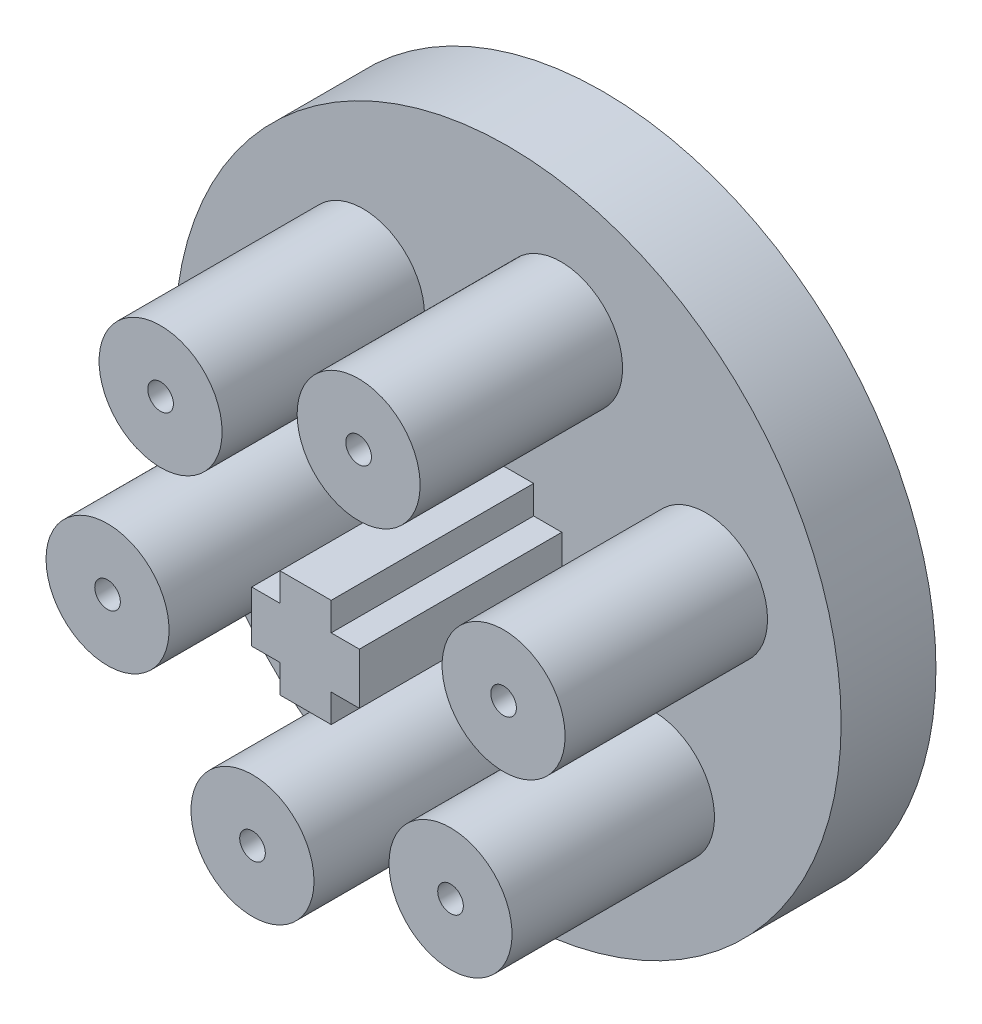
ISO-10303-21;
HEADER;
FILE_DESCRIPTION(('STEP AP214'),'2;1');
FILE_NAME('part.step','',(''),(''),'','','');
FILE_SCHEMA(('AUTOMOTIVE_DESIGN { 1 0 10303 214 1 1 1 1 }'));
ENDSEC;
DATA;
#1=APPLICATION_CONTEXT('core data for automotive mechanical design processes');
#2=APPLICATION_PROTOCOL_DEFINITION('international standard','automotive_design',2000,#1);
#3=PRODUCT_CONTEXT('',#1,'mechanical');
#4=PRODUCT('Part','Part','',(#3));
#5=PRODUCT_RELATED_PRODUCT_CATEGORY('part','',(#4));
#6=PRODUCT_DEFINITION_FORMATION('','',#4);
#7=PRODUCT_DEFINITION_CONTEXT('part definition',#1,'design');
#8=PRODUCT_DEFINITION('design','',#6,#7);
#9=PRODUCT_DEFINITION_SHAPE('','',#8);
#10=(LENGTH_UNIT() NAMED_UNIT(*) SI_UNIT(.MILLI.,.METRE.));
#11=(NAMED_UNIT(*) PLANE_ANGLE_UNIT() SI_UNIT($,.RADIAN.));
#12=(NAMED_UNIT(*) SI_UNIT($,.STERADIAN.) SOLID_ANGLE_UNIT());
#13=UNCERTAINTY_MEASURE_WITH_UNIT(LENGTH_MEASURE(1.E-05),#10,'distance_accuracy_value','');
#14=(GEOMETRIC_REPRESENTATION_CONTEXT(3) GLOBAL_UNCERTAINTY_ASSIGNED_CONTEXT((#13)) GLOBAL_UNIT_ASSIGNED_CONTEXT((#10,
#11,#12)) REPRESENTATION_CONTEXT('',''));
#15=CARTESIAN_POINT('',(0.,0.,0.));
#16=DIRECTION('',(0.,0.,1.));
#17=DIRECTION('',(1.,0.,0.));
#18=AXIS2_PLACEMENT_3D('',#15,#16,#17);
#19=CARTESIAN_POINT('',(0.,0.,3.7));
#20=DIRECTION('',(0.,0.,1.));
#21=DIRECTION('',(1.,0.,0.));
#22=AXIS2_PLACEMENT_3D('',#19,#20,#21);
#23=PLANE('',#22);
#24=CARTESIAN_POINT('',(-7.72740661031258,-2.07055236082003,3.7));
#25=DIRECTION('',(0.,0.,1.));
#26=DIRECTION('',(0.50000000000001,0.866025403784433,0.));
#27=AXIS2_PLACEMENT_3D('',#24,#25,#26);
#28=CIRCLE('',#27,2.4);
#29=CARTESIAN_POINT('',(-6.52740661031256,0.00790860826260396,3.7));
#30=VERTEX_POINT('',#29);
#31=EDGE_CURVE('E767',#30,#30,#28,.T.);
#32=ORIENTED_EDGE('',*,*,#31,.F.);
#33=EDGE_LOOP('',(#32));
#34=FACE_BOUND('',#33,.T.);
#35=CARTESIAN_POINT('',(-2.07055236082028,-7.72740661031252,3.7));
#36=DIRECTION('',(0.,0.,1.));
#37=DIRECTION('',(-0.499999999999992,0.866025403784443,0.));
#38=AXIS2_PLACEMENT_3D('',#35,#36,#37);
#39=CIRCLE('',#38,2.4);
#40=CARTESIAN_POINT('',(-3.27055236082026,-5.64894564122985,3.7));
#41=VERTEX_POINT('',#40);
#42=EDGE_CURVE('E758',#41,#41,#39,.T.);
#43=ORIENTED_EDGE('',*,*,#42,.F.);
#44=EDGE_LOOP('',(#43));
#45=FACE_BOUND('',#44,.T.);
#46=CARTESIAN_POINT('',(5.65685424949235,-5.65685424949241,3.7));
#47=DIRECTION('',(0.,0.,1.));
#48=DIRECTION('',(-1.,0.,0.));
#49=AXIS2_PLACEMENT_3D('',#46,#47,#48);
#50=CIRCLE('',#49,2.4);
#51=CARTESIAN_POINT('',(3.25685424949235,-5.65685424949241,3.7));
#52=VERTEX_POINT('',#51);
#53=EDGE_CURVE('E749',#52,#52,#50,.T.);
#54=ORIENTED_EDGE('',*,*,#53,.F.);
#55=EDGE_LOOP('',(#54));
#56=FACE_BOUND('',#55,.T.);
#57=CARTESIAN_POINT('',(7.72740661031257,2.07055236082009,3.7));
#58=DIRECTION('',(0.,0.,1.));
#59=DIRECTION('',(-0.500000000000004,-0.866025403784436,0.));
#60=AXIS2_PLACEMENT_3D('',#57,#58,#59);
#61=CIRCLE('',#60,2.4);
#62=CARTESIAN_POINT('',(6.52740661031256,-0.00790860826255799,3.7));
#63=VERTEX_POINT('',#62);
#64=EDGE_CURVE('E741',#63,#63,#61,.T.);
#65=ORIENTED_EDGE('',*,*,#64,.F.);
#66=EDGE_LOOP('',(#65));
#67=FACE_BOUND('',#66,.T.);
#68=CARTESIAN_POINT('',(2.07055236082022,7.72740661031253,3.7));
#69=DIRECTION('',(0.,0.,1.));
#70=DIRECTION('',(0.499999999999998,-0.86602540378444,0.));
#71=AXIS2_PLACEMENT_3D('',#68,#69,#70);
#72=CIRCLE('',#71,2.4);
#73=CARTESIAN_POINT('',(3.27055236082022,5.64894564122988,3.7));
#74=VERTEX_POINT('',#73);
#75=EDGE_CURVE('E732',#74,#74,#72,.T.);
#76=ORIENTED_EDGE('',*,*,#75,.F.);
#77=EDGE_LOOP('',(#76));
#78=FACE_BOUND('',#77,.T.);
#79=CARTESIAN_POINT('',(-5.65685424949235,5.65685424949241,3.7));
#80=DIRECTION('',(0.,0.,1.));
#81=DIRECTION('',(1.,0.,0.));
#82=AXIS2_PLACEMENT_3D('',#79,#80,#81);
#83=CIRCLE('',#82,2.4);
#84=CARTESIAN_POINT('',(-3.25685424949235,5.65685424949241,3.7));
#85=VERTEX_POINT('',#84);
#86=EDGE_CURVE('E156',#85,#85,#83,.T.);
#87=ORIENTED_EDGE('',*,*,#86,.F.);
#88=EDGE_LOOP('',(#87));
#89=FACE_BOUND('',#88,.T.);
#90=CARTESIAN_POINT('',(0.,0.,3.7));
#91=DIRECTION('',(0.,0.,1.));
#92=DIRECTION('',(1.,0.,0.));
#93=AXIS2_PLACEMENT_3D('',#90,#91,#92);
#94=CIRCLE('',#93,13.);
#95=CARTESIAN_POINT('',(13.,0.,3.7));
#96=VERTEX_POINT('',#95);
#97=EDGE_CURVE('E180',#96,#96,#94,.T.);
#98=ORIENTED_EDGE('',*,*,#97,.T.);
#99=EDGE_LOOP('',(#98));
#100=FACE_BOUND('',#99,.T.);
#101=DIRECTION('',(0.,1.,0.));
#102=VECTOR('',#101,1.);
#103=CARTESIAN_POINT('',(-2.1,-1.,3.7));
#104=LINE('',#103,#102);
#105=CARTESIAN_POINT('',(-2.1,-1.,3.7));
#106=VERTEX_POINT('',#105);
#107=CARTESIAN_POINT('',(-2.1,1.,3.7));
#108=VERTEX_POINT('',#107);
#109=EDGE_CURVE('E170',#106,#108,#104,.T.);
#110=ORIENTED_EDGE('',*,*,#109,.T.);
#111=DIRECTION('',(1.,0.,0.));
#112=VECTOR('',#111,1.);
#113=CARTESIAN_POINT('',(-2.1,1.,3.7));
#114=LINE('',#113,#112);
#115=CARTESIAN_POINT('',(-1.,1.,3.7));
#116=VERTEX_POINT('',#115);
#117=EDGE_CURVE('E78',#108,#116,#114,.T.);
#118=ORIENTED_EDGE('',*,*,#117,.T.);
#119=DIRECTION('',(0.,1.,0.));
#120=VECTOR('',#119,1.);
#121=CARTESIAN_POINT('',(-1.,-2.1,3.7));
#122=LINE('',#121,#120);
#123=CARTESIAN_POINT('',(-1.,2.1,3.7));
#124=VERTEX_POINT('',#123);
#125=EDGE_CURVE('E145',#116,#124,#122,.T.);
#126=ORIENTED_EDGE('',*,*,#125,.T.);
#127=DIRECTION('',(1.,0.,0.));
#128=VECTOR('',#127,1.);
#129=CARTESIAN_POINT('',(-1.,2.1,3.7));
#130=LINE('',#129,#128);
#131=CARTESIAN_POINT('',(1.,2.1,3.7));
#132=VERTEX_POINT('',#131);
#133=EDGE_CURVE('E161',#124,#132,#130,.T.);
#134=ORIENTED_EDGE('',*,*,#133,.T.);
#135=DIRECTION('',(0.,1.,0.));
#136=VECTOR('',#135,1.);
#137=CARTESIAN_POINT('',(1.,-2.1,3.7));
#138=LINE('',#137,#136);
#139=CARTESIAN_POINT('',(1.,1.,3.7));
#140=VERTEX_POINT('',#139);
#141=EDGE_CURVE('E151',#140,#132,#138,.T.);
#142=ORIENTED_EDGE('',*,*,#141,.F.);
#143=CARTESIAN_POINT('',(2.1,1.,3.7));
#144=VERTEX_POINT('',#143);
#145=EDGE_CURVE('E674',#140,#144,#114,.T.);
#146=ORIENTED_EDGE('',*,*,#145,.T.);
#147=DIRECTION('',(0.,1.,0.));
#148=VECTOR('',#147,1.);
#149=CARTESIAN_POINT('',(2.1,-1.,3.7));
#150=LINE('',#149,#148);
#151=CARTESIAN_POINT('',(2.1,-1.,3.7));
#152=VERTEX_POINT('',#151);
#153=EDGE_CURVE('E711',#152,#144,#150,.T.);
#154=ORIENTED_EDGE('',*,*,#153,.F.);
#155=DIRECTION('',(1.,0.,0.));
#156=VECTOR('',#155,1.);
#157=CARTESIAN_POINT('',(-2.1,-1.,3.7));
#158=LINE('',#157,#156);
#159=CARTESIAN_POINT('',(1.,-1.,3.7));
#160=VERTEX_POINT('',#159);
#161=EDGE_CURVE('E710',#160,#152,#158,.T.);
#162=ORIENTED_EDGE('',*,*,#161,.F.);
#163=CARTESIAN_POINT('',(1.,-2.1,3.7));
#164=VERTEX_POINT('',#163);
#165=EDGE_CURVE('E150',#164,#160,#138,.T.);
#166=ORIENTED_EDGE('',*,*,#165,.F.);
#167=DIRECTION('',(1.,0.,0.));
#168=VECTOR('',#167,1.);
#169=CARTESIAN_POINT('',(-1.,-2.1,3.7));
#170=LINE('',#169,#168);
#171=CARTESIAN_POINT('',(-1.,-2.1,3.7));
#172=VERTEX_POINT('',#171);
#173=EDGE_CURVE('E125',#172,#164,#170,.T.);
#174=ORIENTED_EDGE('',*,*,#173,.F.);
#175=CARTESIAN_POINT('',(-1.,-1.,3.7));
#176=VERTEX_POINT('',#175);
#177=EDGE_CURVE('E137',#172,#176,#122,.T.);
#178=ORIENTED_EDGE('',*,*,#177,.T.);
#179=EDGE_CURVE('E707',#106,#176,#158,.T.);
#180=ORIENTED_EDGE('',*,*,#179,.F.);
#181=EDGE_LOOP('',(#110,#118,#126,#134,#142,#146,#154,#162,#166,#174,#178,#180));
#182=FACE_BOUND('',#181,.T.);
#183=ADVANCED_FACE('F63',(#34,#45,#56,#67,#78,#89,#100,#182),#23,.T.);
#184=CARTESIAN_POINT('',(0.,0.,3.7));
#185=DIRECTION('',(0.,0.,-1.));
#186=DIRECTION('',(-1.,0.,0.));
#187=AXIS2_PLACEMENT_3D('',#184,#185,#186);
#188=CYLINDRICAL_SURFACE('',#187,13.);
#189=ORIENTED_EDGE('',*,*,#97,.F.);
#190=EDGE_LOOP('',(#189));
#191=FACE_BOUND('',#190,.T.);
#192=CARTESIAN_POINT('',(0.,0.,0.));
#193=DIRECTION('',(0.,0.,1.));
#194=DIRECTION('',(1.,0.,0.));
#195=AXIS2_PLACEMENT_3D('',#192,#193,#194);
#196=CIRCLE('',#195,13.);
#197=CARTESIAN_POINT('',(13.,0.,0.));
#198=VERTEX_POINT('',#197);
#199=EDGE_CURVE('E179',#198,#198,#196,.T.);
#200=ORIENTED_EDGE('',*,*,#199,.T.);
#201=EDGE_LOOP('',(#200));
#202=FACE_BOUND('',#201,.T.);
#203=ADVANCED_FACE('F65',(#191,#202),#188,.T.);
#204=CARTESIAN_POINT('',(0.,0.,0.));
#205=DIRECTION('',(0.,0.,1.));
#206=DIRECTION('',(1.,0.,0.));
#207=AXIS2_PLACEMENT_3D('',#204,#205,#206);
#208=PLANE('',#207);
#209=ORIENTED_EDGE('',*,*,#199,.F.);
#210=EDGE_LOOP('',(#209));
#211=FACE_BOUND('',#210,.T.);
#212=ADVANCED_FACE('F232',(#211),#208,.F.);
#213=CARTESIAN_POINT('',(-2.1,1.,11.6));
#214=DIRECTION('',(0.,1.,0.));
#215=DIRECTION('',(0.,0.,1.));
#216=AXIS2_PLACEMENT_3D('',#213,#214,#215);
#217=PLANE('',#216);
#218=DIRECTION('',(0.,0.,1.));
#219=VECTOR('',#218,1.);
#220=CARTESIAN_POINT('',(-1.,1.,11.6));
#221=LINE('',#220,#219);
#222=CARTESIAN_POINT('',(-1.,1.,11.6));
#223=VERTEX_POINT('',#222);
#224=EDGE_CURVE('E171',#116,#223,#221,.T.);
#225=ORIENTED_EDGE('',*,*,#224,.F.);
#226=ORIENTED_EDGE('',*,*,#117,.F.);
#227=DIRECTION('',(0.,0.,-1.));
#228=VECTOR('',#227,1.);
#229=CARTESIAN_POINT('',(-2.1,1.,11.6));
#230=LINE('',#229,#228);
#231=CARTESIAN_POINT('',(-2.1,1.,11.6));
#232=VERTEX_POINT('',#231);
#233=EDGE_CURVE('E698',#232,#108,#230,.T.);
#234=ORIENTED_EDGE('',*,*,#233,.F.);
#235=DIRECTION('',(1.,0.,0.));
#236=VECTOR('',#235,1.);
#237=CARTESIAN_POINT('',(-2.1,1.,11.6));
#238=LINE('',#237,#236);
#239=EDGE_CURVE('E720',#232,#223,#238,.T.);
#240=ORIENTED_EDGE('',*,*,#239,.T.);
#241=EDGE_LOOP('',(#225,#226,#234,#240));
#242=FACE_BOUND('',#241,.T.);
#243=ADVANCED_FACE('F314',(#242),#217,.T.);
#244=CARTESIAN_POINT('',(-2.1,-1.,11.6));
#245=DIRECTION('',(-1.,0.,0.));
#246=DIRECTION('',(0.,0.,1.));
#247=AXIS2_PLACEMENT_3D('',#244,#245,#246);
#248=PLANE('',#247);
#249=ORIENTED_EDGE('',*,*,#109,.F.);
#250=DIRECTION('',(0.,0.,-1.));
#251=VECTOR('',#250,1.);
#252=CARTESIAN_POINT('',(-2.1,-1.,11.6));
#253=LINE('',#252,#251);
#254=CARTESIAN_POINT('',(-2.1,-1.,11.6));
#255=VERTEX_POINT('',#254);
#256=EDGE_CURVE('E173',#255,#106,#253,.T.);
#257=ORIENTED_EDGE('',*,*,#256,.F.);
#258=DIRECTION('',(0.,1.,0.));
#259=VECTOR('',#258,1.);
#260=CARTESIAN_POINT('',(-2.1,-1.,11.6));
#261=LINE('',#260,#259);
#262=EDGE_CURVE('E709',#255,#232,#261,.T.);
#263=ORIENTED_EDGE('',*,*,#262,.T.);
#264=ORIENTED_EDGE('',*,*,#233,.T.);
#265=EDGE_LOOP('',(#249,#257,#263,#264));
#266=FACE_BOUND('',#265,.T.);
#267=ADVANCED_FACE('F307',(#266),#248,.T.);
#268=CARTESIAN_POINT('',(-2.1,-1.,11.6));
#269=DIRECTION('',(0.,1.,0.));
#270=DIRECTION('',(0.,0.,1.));
#271=AXIS2_PLACEMENT_3D('',#268,#269,#270);
#272=PLANE('',#271);
#273=ORIENTED_EDGE('',*,*,#179,.T.);
#274=DIRECTION('',(0.,0.,1.));
#275=VECTOR('',#274,1.);
#276=CARTESIAN_POINT('',(-1.,-1.,11.6));
#277=LINE('',#276,#275);
#278=CARTESIAN_POINT('',(-1.,-1.,11.6));
#279=VERTEX_POINT('',#278);
#280=EDGE_CURVE('E141',#176,#279,#277,.T.);
#281=ORIENTED_EDGE('',*,*,#280,.T.);
#282=DIRECTION('',(1.,0.,0.));
#283=VECTOR('',#282,1.);
#284=CARTESIAN_POINT('',(-2.1,-1.,11.6));
#285=LINE('',#284,#283);
#286=EDGE_CURVE('E700',#255,#279,#285,.T.);
#287=ORIENTED_EDGE('',*,*,#286,.F.);
#288=ORIENTED_EDGE('',*,*,#256,.T.);
#289=EDGE_LOOP('',(#273,#281,#287,#288));
#290=FACE_BOUND('',#289,.T.);
#291=ADVANCED_FACE('F303',(#290),#272,.F.);
#292=CARTESIAN_POINT('',(0.,0.,11.6));
#293=DIRECTION('',(0.,0.,-1.));
#294=DIRECTION('',(-1.,0.,0.));
#295=AXIS2_PLACEMENT_3D('',#292,#293,#294);
#296=PLANE('',#295);
#297=ORIENTED_EDGE('',*,*,#286,.T.);
#298=DIRECTION('',(0.,1.,0.));
#299=VECTOR('',#298,1.);
#300=CARTESIAN_POINT('',(-1.,-2.1,11.6));
#301=LINE('',#300,#299);
#302=CARTESIAN_POINT('',(-1.,-2.1,11.6));
#303=VERTEX_POINT('',#302);
#304=EDGE_CURVE('E133',#303,#279,#301,.T.);
#305=ORIENTED_EDGE('',*,*,#304,.F.);
#306=DIRECTION('',(1.,0.,0.));
#307=VECTOR('',#306,1.);
#308=CARTESIAN_POINT('',(-1.,-2.1,11.6));
#309=LINE('',#308,#307);
#310=CARTESIAN_POINT('',(1.,-2.1,11.6));
#311=VERTEX_POINT('',#310);
#312=EDGE_CURVE('E128',#303,#311,#309,.T.);
#313=ORIENTED_EDGE('',*,*,#312,.T.);
#314=DIRECTION('',(0.,1.,0.));
#315=VECTOR('',#314,1.);
#316=CARTESIAN_POINT('',(1.,-2.1,11.6));
#317=LINE('',#316,#315);
#318=CARTESIAN_POINT('',(1.,-1.,11.6));
#319=VERTEX_POINT('',#318);
#320=EDGE_CURVE('E692',#311,#319,#317,.T.);
#321=ORIENTED_EDGE('',*,*,#320,.T.);
#322=CARTESIAN_POINT('',(2.1,-1.,11.6));
#323=VERTEX_POINT('',#322);
#324=EDGE_CURVE('E716',#319,#323,#285,.T.);
#325=ORIENTED_EDGE('',*,*,#324,.T.);
#326=DIRECTION('',(0.,1.,0.));
#327=VECTOR('',#326,1.);
#328=CARTESIAN_POINT('',(2.1,-1.,11.6));
#329=LINE('',#328,#327);
#330=CARTESIAN_POINT('',(2.1,1.,11.6));
#331=VERTEX_POINT('',#330);
#332=EDGE_CURVE('E717',#323,#331,#329,.T.);
#333=ORIENTED_EDGE('',*,*,#332,.T.);
#334=CARTESIAN_POINT('',(1.,1.,11.6));
#335=VERTEX_POINT('',#334);
#336=EDGE_CURVE('E723',#335,#331,#238,.T.);
#337=ORIENTED_EDGE('',*,*,#336,.F.);
#338=CARTESIAN_POINT('',(1.,2.1,11.6));
#339=VERTEX_POINT('',#338);
#340=EDGE_CURVE('E694',#335,#339,#317,.T.);
#341=ORIENTED_EDGE('',*,*,#340,.T.);
#342=DIRECTION('',(1.,0.,0.));
#343=VECTOR('',#342,1.);
#344=CARTESIAN_POINT('',(-1.,2.1,11.6));
#345=LINE('',#344,#343);
#346=CARTESIAN_POINT('',(-1.,2.1,11.6));
#347=VERTEX_POINT('',#346);
#348=EDGE_CURVE('E689',#347,#339,#345,.T.);
#349=ORIENTED_EDGE('',*,*,#348,.F.);
#350=EDGE_CURVE('E691',#223,#347,#301,.T.);
#351=ORIENTED_EDGE('',*,*,#350,.F.);
#352=ORIENTED_EDGE('',*,*,#239,.F.);
#353=ORIENTED_EDGE('',*,*,#262,.F.);
#354=EDGE_LOOP('',(#297,#305,#313,#321,#325,#333,#337,#341,#349,#351,#352,#353));
#355=FACE_BOUND('',#354,.T.);
#356=ADVANCED_FACE('F299',(#355),#296,.F.);
#357=CARTESIAN_POINT('',(2.1,-1.,11.6));
#358=DIRECTION('',(-1.,0.,0.));
#359=DIRECTION('',(0.,0.,1.));
#360=AXIS2_PLACEMENT_3D('',#357,#358,#359);
#361=PLANE('',#360);
#362=ORIENTED_EDGE('',*,*,#153,.T.);
#363=DIRECTION('',(0.,0.,-1.));
#364=VECTOR('',#363,1.);
#365=CARTESIAN_POINT('',(2.1,1.,11.6));
#366=LINE('',#365,#364);
#367=EDGE_CURVE('E677',#331,#144,#366,.T.);
#368=ORIENTED_EDGE('',*,*,#367,.F.);
#369=ORIENTED_EDGE('',*,*,#332,.F.);
#370=DIRECTION('',(0.,0.,-1.));
#371=VECTOR('',#370,1.);
#372=CARTESIAN_POINT('',(2.1,-1.,11.6));
#373=LINE('',#372,#371);
#374=EDGE_CURVE('E702',#323,#152,#373,.T.);
#375=ORIENTED_EDGE('',*,*,#374,.T.);
#376=EDGE_LOOP('',(#362,#368,#369,#375));
#377=FACE_BOUND('',#376,.T.);
#378=ADVANCED_FACE('F302',(#377),#361,.F.);
#379=ORIENTED_EDGE('',*,*,#145,.F.);
#380=DIRECTION('',(0.,0.,1.));
#381=VECTOR('',#380,1.);
#382=CARTESIAN_POINT('',(1.,1.,11.6));
#383=LINE('',#382,#381);
#384=EDGE_CURVE('E87',#140,#335,#383,.T.);
#385=ORIENTED_EDGE('',*,*,#384,.T.);
#386=ORIENTED_EDGE('',*,*,#336,.T.);
#387=ORIENTED_EDGE('',*,*,#367,.T.);
#388=EDGE_LOOP('',(#379,#385,#386,#387));
#389=FACE_BOUND('',#388,.T.);
#390=ADVANCED_FACE('F312',(#389),#217,.T.);
#391=DIRECTION('',(0.,0.,1.));
#392=VECTOR('',#391,1.);
#393=CARTESIAN_POINT('',(1.,-1.,11.6));
#394=LINE('',#393,#392);
#395=EDGE_CURVE('E175',#160,#319,#394,.T.);
#396=ORIENTED_EDGE('',*,*,#395,.F.);
#397=ORIENTED_EDGE('',*,*,#161,.T.);
#398=ORIENTED_EDGE('',*,*,#374,.F.);
#399=ORIENTED_EDGE('',*,*,#324,.F.);
#400=EDGE_LOOP('',(#396,#397,#398,#399));
#401=FACE_BOUND('',#400,.T.);
#402=ADVANCED_FACE('F309',(#401),#272,.F.);
#403=CARTESIAN_POINT('',(1.,-2.1,11.6));
#404=DIRECTION('',(-1.,0.,0.));
#405=DIRECTION('',(0.,0.,1.));
#406=AXIS2_PLACEMENT_3D('',#403,#404,#405);
#407=PLANE('',#406);
#408=ORIENTED_EDGE('',*,*,#384,.F.);
#409=ORIENTED_EDGE('',*,*,#141,.T.);
#410=DIRECTION('',(0.,0.,-1.));
#411=VECTOR('',#410,1.);
#412=CARTESIAN_POINT('',(1.,2.1,11.6));
#413=LINE('',#412,#411);
#414=EDGE_CURVE('E165',#339,#132,#413,.T.);
#415=ORIENTED_EDGE('',*,*,#414,.F.);
#416=ORIENTED_EDGE('',*,*,#340,.F.);
#417=EDGE_LOOP('',(#408,#409,#415,#416));
#418=FACE_BOUND('',#417,.T.);
#419=ADVANCED_FACE('F328',(#418),#407,.F.);
#420=CARTESIAN_POINT('',(-1.,2.1,11.6));
#421=DIRECTION('',(0.,1.,0.));
#422=DIRECTION('',(0.,0.,1.));
#423=AXIS2_PLACEMENT_3D('',#420,#421,#422);
#424=PLANE('',#423);
#425=ORIENTED_EDGE('',*,*,#133,.F.);
#426=DIRECTION('',(0.,0.,-1.));
#427=VECTOR('',#426,1.);
#428=CARTESIAN_POINT('',(-1.,2.1,11.6));
#429=LINE('',#428,#427);
#430=EDGE_CURVE('E132',#347,#124,#429,.T.);
#431=ORIENTED_EDGE('',*,*,#430,.F.);
#432=ORIENTED_EDGE('',*,*,#348,.T.);
#433=ORIENTED_EDGE('',*,*,#414,.T.);
#434=EDGE_LOOP('',(#425,#431,#432,#433));
#435=FACE_BOUND('',#434,.T.);
#436=ADVANCED_FACE('F323',(#435),#424,.T.);
#437=CARTESIAN_POINT('',(-1.,-2.1,11.6));
#438=DIRECTION('',(-1.,0.,0.));
#439=DIRECTION('',(0.,0.,1.));
#440=AXIS2_PLACEMENT_3D('',#437,#438,#439);
#441=PLANE('',#440);
#442=ORIENTED_EDGE('',*,*,#125,.F.);
#443=ORIENTED_EDGE('',*,*,#224,.T.);
#444=ORIENTED_EDGE('',*,*,#350,.T.);
#445=ORIENTED_EDGE('',*,*,#430,.T.);
#446=EDGE_LOOP('',(#442,#443,#444,#445));
#447=FACE_BOUND('',#446,.T.);
#448=ADVANCED_FACE('F320',(#447),#441,.T.);
#449=CARTESIAN_POINT('',(-1.,-2.1,11.6));
#450=DIRECTION('',(0.,1.,0.));
#451=DIRECTION('',(0.,0.,1.));
#452=AXIS2_PLACEMENT_3D('',#449,#450,#451);
#453=PLANE('',#452);
#454=ORIENTED_EDGE('',*,*,#173,.T.);
#455=DIRECTION('',(0.,0.,-1.));
#456=VECTOR('',#455,1.);
#457=CARTESIAN_POINT('',(1.,-2.1,11.6));
#458=LINE('',#457,#456);
#459=EDGE_CURVE('E168',#311,#164,#458,.T.);
#460=ORIENTED_EDGE('',*,*,#459,.F.);
#461=ORIENTED_EDGE('',*,*,#312,.F.);
#462=DIRECTION('',(0.,0.,-1.));
#463=VECTOR('',#462,1.);
#464=CARTESIAN_POINT('',(-1.,-2.1,11.6));
#465=LINE('',#464,#463);
#466=EDGE_CURVE('E120',#303,#172,#465,.T.);
#467=ORIENTED_EDGE('',*,*,#466,.T.);
#468=EDGE_LOOP('',(#454,#460,#461,#467));
#469=FACE_BOUND('',#468,.T.);
#470=ADVANCED_FACE('F122',(#469),#453,.F.);
#471=ORIENTED_EDGE('',*,*,#165,.T.);
#472=ORIENTED_EDGE('',*,*,#395,.T.);
#473=ORIENTED_EDGE('',*,*,#320,.F.);
#474=ORIENTED_EDGE('',*,*,#459,.T.);
#475=EDGE_LOOP('',(#471,#472,#473,#474));
#476=FACE_BOUND('',#475,.T.);
#477=ADVANCED_FACE('F325',(#476),#407,.F.);
#478=ORIENTED_EDGE('',*,*,#280,.F.);
#479=ORIENTED_EDGE('',*,*,#177,.F.);
#480=ORIENTED_EDGE('',*,*,#466,.F.);
#481=ORIENTED_EDGE('',*,*,#304,.T.);
#482=EDGE_LOOP('',(#478,#479,#480,#481));
#483=FACE_BOUND('',#482,.T.);
#484=ADVANCED_FACE('F138',(#483),#441,.T.);
#485=CARTESIAN_POINT('',(-5.65685424949235,5.65685424949241,11.6));
#486=DIRECTION('',(0.,0.,1.));
#487=DIRECTION('',(1.,0.,0.));
#488=AXIS2_PLACEMENT_3D('',#485,#486,#487);
#489=PLANE('',#488);
#490=CARTESIAN_POINT('',(-5.65685424949235,5.65685424949241,11.6));
#491=DIRECTION('',(0.,0.,1.));
#492=DIRECTION('',(1.,0.,0.));
#493=AXIS2_PLACEMENT_3D('',#490,#491,#492);
#494=CIRCLE('',#493,2.4);
#495=CARTESIAN_POINT('',(-3.25685424949235,5.65685424949241,11.6));
#496=VERTEX_POINT('',#495);
#497=EDGE_CURVE('E152',#496,#496,#494,.T.);
#498=ORIENTED_EDGE('',*,*,#497,.T.);
#499=EDGE_LOOP('',(#498));
#500=FACE_BOUND('',#499,.T.);
#501=CARTESIAN_POINT('',(-5.65685424949235,5.65685424949241,11.6));
#502=DIRECTION('',(0.,0.,1.));
#503=DIRECTION('',(1.,0.,0.));
#504=AXIS2_PLACEMENT_3D('',#501,#502,#503);
#505=CIRCLE('',#504,0.500000000000001);
#506=CARTESIAN_POINT('',(-5.15685424949235,5.65685424949241,11.6));
#507=VERTEX_POINT('',#506);
#508=EDGE_CURVE('E727',#507,#507,#505,.T.);
#509=ORIENTED_EDGE('',*,*,#508,.F.);
#510=EDGE_LOOP('',(#509));
#511=FACE_BOUND('',#510,.T.);
#512=ADVANCED_FACE('F292',(#500,#511),#489,.T.);
#513=CARTESIAN_POINT('',(-5.65685424949235,5.65685424949241,11.6));
#514=DIRECTION('',(0.,0.,-1.));
#515=DIRECTION('',(-1.,0.,0.));
#516=AXIS2_PLACEMENT_3D('',#513,#514,#515);
#517=CYLINDRICAL_SURFACE('',#516,2.4);
#518=ORIENTED_EDGE('',*,*,#497,.F.);
#519=EDGE_LOOP('',(#518));
#520=FACE_BOUND('',#519,.T.);
#521=ORIENTED_EDGE('',*,*,#86,.T.);
#522=EDGE_LOOP('',(#521));
#523=FACE_BOUND('',#522,.T.);
#524=ADVANCED_FACE('F248',(#520,#523),#517,.T.);
#525=CARTESIAN_POINT('',(-5.65685424949235,5.65685424949241,11.6));
#526=DIRECTION('',(0.,0.,-1.));
#527=DIRECTION('',(-1.,0.,0.));
#528=AXIS2_PLACEMENT_3D('',#525,#526,#527);
#529=CYLINDRICAL_SURFACE('',#528,0.500000000000001);
#530=ORIENTED_EDGE('',*,*,#508,.T.);
#531=EDGE_LOOP('',(#530));
#532=FACE_BOUND('',#531,.T.);
#533=CARTESIAN_POINT('',(-5.65685424949235,5.65685424949241,3.7));
#534=DIRECTION('',(0.,0.,1.));
#535=DIRECTION('',(1.,0.,0.));
#536=AXIS2_PLACEMENT_3D('',#533,#534,#535);
#537=CIRCLE('',#536,0.500000000000001);
#538=CARTESIAN_POINT('',(-5.15685424949235,5.65685424949241,3.7));
#539=VERTEX_POINT('',#538);
#540=EDGE_CURVE('E183',#539,#539,#537,.F.);
#541=ORIENTED_EDGE('',*,*,#540,.T.);
#542=EDGE_LOOP('',(#541));
#543=FACE_BOUND('',#542,.T.);
#544=ADVANCED_FACE('F238',(#532,#543),#529,.F.);
#545=ORIENTED_EDGE('',*,*,#540,.F.);
#546=EDGE_LOOP('',(#545));
#547=FACE_BOUND('',#546,.T.);
#548=ADVANCED_FACE('F228',(#547),#23,.T.);
#549=CARTESIAN_POINT('',(2.07055236082022,7.72740661031253,11.6));
#550=DIRECTION('',(0.,0.,1.));
#551=DIRECTION('',(0.499999999999998,-0.86602540378444,0.));
#552=AXIS2_PLACEMENT_3D('',#549,#550,#551);
#553=PLANE('',#552);
#554=CARTESIAN_POINT('',(2.07055236082022,7.72740661031253,11.6));
#555=DIRECTION('',(0.,0.,1.));
#556=DIRECTION('',(0.499999999999998,-0.86602540378444,0.));
#557=AXIS2_PLACEMENT_3D('',#554,#555,#556);
#558=CIRCLE('',#557,2.4);
#559=CARTESIAN_POINT('',(3.27055236082022,5.64894564122988,11.6));
#560=VERTEX_POINT('',#559);
#561=EDGE_CURVE('E731',#560,#560,#558,.T.);
#562=ORIENTED_EDGE('',*,*,#561,.T.);
#563=EDGE_LOOP('',(#562));
#564=FACE_BOUND('',#563,.T.);
#565=CARTESIAN_POINT('',(2.07055236082022,7.72740661031253,11.6));
#566=DIRECTION('',(0.,0.,1.));
#567=DIRECTION('',(0.499999999999998,-0.86602540378444,0.));
#568=AXIS2_PLACEMENT_3D('',#565,#566,#567);
#569=CIRCLE('',#568,0.500000000000001);
#570=CARTESIAN_POINT('',(2.32055236082022,7.29439390842031,11.6));
#571=VERTEX_POINT('',#570);
#572=EDGE_CURVE('E735',#571,#571,#569,.T.);
#573=ORIENTED_EDGE('',*,*,#572,.F.);
#574=EDGE_LOOP('',(#573));
#575=FACE_BOUND('',#574,.T.);
#576=ADVANCED_FACE('F237',(#564,#575),#553,.T.);
#577=CARTESIAN_POINT('',(2.07055236082022,7.72740661031253,11.6));
#578=DIRECTION('',(0.,0.,-1.));
#579=DIRECTION('',(-1.,0.,0.));
#580=AXIS2_PLACEMENT_3D('',#577,#578,#579);
#581=CYLINDRICAL_SURFACE('',#580,2.4);
#582=ORIENTED_EDGE('',*,*,#561,.F.);
#583=EDGE_LOOP('',(#582));
#584=FACE_BOUND('',#583,.T.);
#585=ORIENTED_EDGE('',*,*,#75,.T.);
#586=EDGE_LOOP('',(#585));
#587=FACE_BOUND('',#586,.T.);
#588=ADVANCED_FACE('F245',(#584,#587),#581,.T.);
#589=CARTESIAN_POINT('',(2.07055236082022,7.72740661031253,11.6));
#590=DIRECTION('',(0.,0.,-1.));
#591=DIRECTION('',(-1.,0.,0.));
#592=AXIS2_PLACEMENT_3D('',#589,#590,#591);
#593=CYLINDRICAL_SURFACE('',#592,0.500000000000001);
#594=ORIENTED_EDGE('',*,*,#572,.T.);
#595=EDGE_LOOP('',(#594));
#596=FACE_BOUND('',#595,.T.);
#597=CARTESIAN_POINT('',(2.07055236082022,7.72740661031253,3.7));
#598=DIRECTION('',(0.,0.,1.));
#599=DIRECTION('',(1.,0.,0.));
#600=AXIS2_PLACEMENT_3D('',#597,#598,#599);
#601=CIRCLE('',#600,0.500000000000001);
#602=CARTESIAN_POINT('',(2.57055236082023,7.72740661031253,3.7));
#603=VERTEX_POINT('',#602);
#604=EDGE_CURVE('E188',#603,#603,#601,.F.);
#605=ORIENTED_EDGE('',*,*,#604,.T.);
#606=EDGE_LOOP('',(#605));
#607=FACE_BOUND('',#606,.T.);
#608=ADVANCED_FACE('F254',(#596,#607),#593,.F.);
#609=ORIENTED_EDGE('',*,*,#604,.F.);
#610=EDGE_LOOP('',(#609));
#611=FACE_BOUND('',#610,.T.);
#612=ADVANCED_FACE('F240',(#611),#23,.T.);
#613=CARTESIAN_POINT('',(7.72740661031257,2.07055236082009,11.6));
#614=DIRECTION('',(0.,0.,1.));
#615=DIRECTION('',(-0.500000000000004,-0.866025403784436,0.));
#616=AXIS2_PLACEMENT_3D('',#613,#614,#615);
#617=PLANE('',#616);
#618=CARTESIAN_POINT('',(7.72740661031257,2.07055236082009,11.6));
#619=DIRECTION('',(0.,0.,1.));
#620=DIRECTION('',(-0.500000000000004,-0.866025403784436,0.));
#621=AXIS2_PLACEMENT_3D('',#618,#619,#620);
#622=CIRCLE('',#621,2.4);
#623=CARTESIAN_POINT('',(6.52740661031256,-0.00790860826255799,11.6));
#624=VERTEX_POINT('',#623);
#625=EDGE_CURVE('E740',#624,#624,#622,.T.);
#626=ORIENTED_EDGE('',*,*,#625,.T.);
#627=EDGE_LOOP('',(#626));
#628=FACE_BOUND('',#627,.T.);
#629=CARTESIAN_POINT('',(7.72740661031257,2.07055236082009,11.6));
#630=DIRECTION('',(0.,0.,1.));
#631=DIRECTION('',(-0.500000000000004,-0.866025403784436,0.));
#632=AXIS2_PLACEMENT_3D('',#629,#630,#631);
#633=CIRCLE('',#632,0.500000000000001);
#634=CARTESIAN_POINT('',(7.47740661031257,1.63753965892787,11.6));
#635=VERTEX_POINT('',#634);
#636=EDGE_CURVE('E744',#635,#635,#633,.T.);
#637=ORIENTED_EDGE('',*,*,#636,.F.);
#638=EDGE_LOOP('',(#637));
#639=FACE_BOUND('',#638,.T.);
#640=ADVANCED_FACE('F253',(#628,#639),#617,.T.);
#641=CARTESIAN_POINT('',(7.72740661031257,2.07055236082009,11.6));
#642=DIRECTION('',(0.,0.,-1.));
#643=DIRECTION('',(-1.,0.,0.));
#644=AXIS2_PLACEMENT_3D('',#641,#642,#643);
#645=CYLINDRICAL_SURFACE('',#644,2.4);
#646=ORIENTED_EDGE('',*,*,#625,.F.);
#647=EDGE_LOOP('',(#646));
#648=FACE_BOUND('',#647,.T.);
#649=ORIENTED_EDGE('',*,*,#64,.T.);
#650=EDGE_LOOP('',(#649));
#651=FACE_BOUND('',#650,.T.);
#652=ADVANCED_FACE('F260',(#648,#651),#645,.T.);
#653=CARTESIAN_POINT('',(7.72740661031257,2.07055236082009,11.6));
#654=DIRECTION('',(0.,0.,-1.));
#655=DIRECTION('',(-1.,0.,0.));
#656=AXIS2_PLACEMENT_3D('',#653,#654,#655);
#657=CYLINDRICAL_SURFACE('',#656,0.500000000000001);
#658=ORIENTED_EDGE('',*,*,#636,.T.);
#659=EDGE_LOOP('',(#658));
#660=FACE_BOUND('',#659,.T.);
#661=CARTESIAN_POINT('',(7.72740661031257,2.07055236082009,3.7));
#662=DIRECTION('',(0.,0.,1.));
#663=DIRECTION('',(1.,0.,0.));
#664=AXIS2_PLACEMENT_3D('',#661,#662,#663);
#665=CIRCLE('',#664,0.500000000000001);
#666=CARTESIAN_POINT('',(8.22740661031257,2.07055236082009,3.7));
#667=VERTEX_POINT('',#666);
#668=EDGE_CURVE('E191',#667,#667,#665,.F.);
#669=ORIENTED_EDGE('',*,*,#668,.T.);
#670=EDGE_LOOP('',(#669));
#671=FACE_BOUND('',#670,.T.);
#672=ADVANCED_FACE('F268',(#660,#671),#657,.F.);
#673=ORIENTED_EDGE('',*,*,#668,.F.);
#674=EDGE_LOOP('',(#673));
#675=FACE_BOUND('',#674,.T.);
#676=ADVANCED_FACE('F222',(#675),#23,.T.);
#677=CARTESIAN_POINT('',(5.65685424949235,-5.65685424949241,11.6));
#678=DIRECTION('',(0.,0.,1.));
#679=DIRECTION('',(-1.,0.,0.));
#680=AXIS2_PLACEMENT_3D('',#677,#678,#679);
#681=PLANE('',#680);
#682=CARTESIAN_POINT('',(5.65685424949235,-5.65685424949241,11.6));
#683=DIRECTION('',(0.,0.,1.));
#684=DIRECTION('',(-1.,0.,0.));
#685=AXIS2_PLACEMENT_3D('',#682,#683,#684);
#686=CIRCLE('',#685,2.4);
#687=CARTESIAN_POINT('',(3.25685424949235,-5.65685424949241,11.6));
#688=VERTEX_POINT('',#687);
#689=EDGE_CURVE('E748',#688,#688,#686,.T.);
#690=ORIENTED_EDGE('',*,*,#689,.T.);
#691=EDGE_LOOP('',(#690));
#692=FACE_BOUND('',#691,.T.);
#693=CARTESIAN_POINT('',(5.65685424949235,-5.65685424949241,11.6));
#694=DIRECTION('',(0.,0.,1.));
#695=DIRECTION('',(-1.,0.,0.));
#696=AXIS2_PLACEMENT_3D('',#693,#694,#695);
#697=CIRCLE('',#696,0.500000000000001);
#698=CARTESIAN_POINT('',(5.15685424949235,-5.65685424949241,11.6));
#699=VERTEX_POINT('',#698);
#700=EDGE_CURVE('E752',#699,#699,#697,.T.);
#701=ORIENTED_EDGE('',*,*,#700,.F.);
#702=EDGE_LOOP('',(#701));
#703=FACE_BOUND('',#702,.T.);
#704=ADVANCED_FACE('F267',(#692,#703),#681,.T.);
#705=CARTESIAN_POINT('',(5.65685424949235,-5.65685424949241,11.6));
#706=DIRECTION('',(0.,0.,-1.));
#707=DIRECTION('',(-1.,0.,0.));
#708=AXIS2_PLACEMENT_3D('',#705,#706,#707);
#709=CYLINDRICAL_SURFACE('',#708,2.4);
#710=ORIENTED_EDGE('',*,*,#689,.F.);
#711=EDGE_LOOP('',(#710));
#712=FACE_BOUND('',#711,.T.);
#713=ORIENTED_EDGE('',*,*,#53,.T.);
#714=EDGE_LOOP('',(#713));
#715=FACE_BOUND('',#714,.T.);
#716=ADVANCED_FACE('F274',(#712,#715),#709,.T.);
#717=CARTESIAN_POINT('',(5.65685424949235,-5.65685424949241,11.6));
#718=DIRECTION('',(0.,0.,-1.));
#719=DIRECTION('',(-1.,0.,0.));
#720=AXIS2_PLACEMENT_3D('',#717,#718,#719);
#721=CYLINDRICAL_SURFACE('',#720,0.500000000000001);
#722=ORIENTED_EDGE('',*,*,#700,.T.);
#723=EDGE_LOOP('',(#722));
#724=FACE_BOUND('',#723,.T.);
#725=CARTESIAN_POINT('',(5.65685424949235,-5.65685424949241,3.7));
#726=DIRECTION('',(0.,0.,1.));
#727=DIRECTION('',(1.,0.,0.));
#728=AXIS2_PLACEMENT_3D('',#725,#726,#727);
#729=CIRCLE('',#728,0.500000000000001);
#730=CARTESIAN_POINT('',(6.15685424949235,-5.65685424949241,3.7));
#731=VERTEX_POINT('',#730);
#732=EDGE_CURVE('E194',#731,#731,#729,.F.);
#733=ORIENTED_EDGE('',*,*,#732,.T.);
#734=EDGE_LOOP('',(#733));
#735=FACE_BOUND('',#734,.T.);
#736=ADVANCED_FACE('F220',(#724,#735),#721,.F.);
#737=ORIENTED_EDGE('',*,*,#732,.F.);
#738=EDGE_LOOP('',(#737));
#739=FACE_BOUND('',#738,.T.);
#740=ADVANCED_FACE('F205',(#739),#23,.T.);
#741=CARTESIAN_POINT('',(-2.07055236082028,-7.72740661031252,11.6));
#742=DIRECTION('',(0.,0.,1.));
#743=DIRECTION('',(-0.499999999999992,0.866025403784443,0.));
#744=AXIS2_PLACEMENT_3D('',#741,#742,#743);
#745=PLANE('',#744);
#746=CARTESIAN_POINT('',(-2.07055236082028,-7.72740661031252,11.6));
#747=DIRECTION('',(0.,0.,1.));
#748=DIRECTION('',(-0.499999999999992,0.866025403784443,0.));
#749=AXIS2_PLACEMENT_3D('',#746,#747,#748);
#750=CIRCLE('',#749,2.4);
#751=CARTESIAN_POINT('',(-3.27055236082026,-5.64894564122985,11.6));
#752=VERTEX_POINT('',#751);
#753=EDGE_CURVE('E757',#752,#752,#750,.T.);
#754=ORIENTED_EDGE('',*,*,#753,.T.);
#755=EDGE_LOOP('',(#754));
#756=FACE_BOUND('',#755,.T.);
#757=CARTESIAN_POINT('',(-2.07055236082028,-7.72740661031252,11.6));
#758=DIRECTION('',(0.,0.,1.));
#759=DIRECTION('',(-0.499999999999992,0.866025403784443,0.));
#760=AXIS2_PLACEMENT_3D('',#757,#758,#759);
#761=CIRCLE('',#760,0.500000000000001);
#762=CARTESIAN_POINT('',(-2.32055236082027,-7.29439390842029,11.6));
#763=VERTEX_POINT('',#762);
#764=EDGE_CURVE('E761',#763,#763,#761,.T.);
#765=ORIENTED_EDGE('',*,*,#764,.F.);
#766=EDGE_LOOP('',(#765));
#767=FACE_BOUND('',#766,.T.);
#768=ADVANCED_FACE('F219',(#756,#767),#745,.T.);
#769=CARTESIAN_POINT('',(-2.07055236082028,-7.72740661031252,11.6));
#770=DIRECTION('',(0.,0.,-1.));
#771=DIRECTION('',(-1.,0.,0.));
#772=AXIS2_PLACEMENT_3D('',#769,#770,#771);
#773=CYLINDRICAL_SURFACE('',#772,2.4);
#774=ORIENTED_EDGE('',*,*,#753,.F.);
#775=EDGE_LOOP('',(#774));
#776=FACE_BOUND('',#775,.T.);
#777=ORIENTED_EDGE('',*,*,#42,.T.);
#778=EDGE_LOOP('',(#777));
#779=FACE_BOUND('',#778,.T.);
#780=ADVANCED_FACE('F214',(#776,#779),#773,.T.);
#781=CARTESIAN_POINT('',(-2.07055236082028,-7.72740661031252,11.6));
#782=DIRECTION('',(0.,0.,-1.));
#783=DIRECTION('',(-1.,0.,0.));
#784=AXIS2_PLACEMENT_3D('',#781,#782,#783);
#785=CYLINDRICAL_SURFACE('',#784,0.500000000000001);
#786=ORIENTED_EDGE('',*,*,#764,.T.);
#787=EDGE_LOOP('',(#786));
#788=FACE_BOUND('',#787,.T.);
#789=CARTESIAN_POINT('',(-2.07055236082028,-7.72740661031252,3.7));
#790=DIRECTION('',(0.,0.,1.));
#791=DIRECTION('',(1.,0.,0.));
#792=AXIS2_PLACEMENT_3D('',#789,#790,#791);
#793=CIRCLE('',#792,0.500000000000001);
#794=CARTESIAN_POINT('',(-1.57055236082028,-7.72740661031252,3.7));
#795=VERTEX_POINT('',#794);
#796=EDGE_CURVE('E71',#795,#795,#793,.F.);
#797=ORIENTED_EDGE('',*,*,#796,.T.);
#798=EDGE_LOOP('',(#797));
#799=FACE_BOUND('',#798,.T.);
#800=ADVANCED_FACE('F199',(#788,#799),#785,.F.);
#801=ORIENTED_EDGE('',*,*,#796,.F.);
#802=EDGE_LOOP('',(#801));
#803=FACE_BOUND('',#802,.T.);
#804=ADVANCED_FACE('F201',(#803),#23,.T.);
#805=CARTESIAN_POINT('',(-7.72740661031258,-2.07055236082003,11.6));
#806=DIRECTION('',(0.,0.,1.));
#807=DIRECTION('',(0.50000000000001,0.866025403784433,0.));
#808=AXIS2_PLACEMENT_3D('',#805,#806,#807);
#809=PLANE('',#808);
#810=CARTESIAN_POINT('',(-7.72740661031258,-2.07055236082003,11.6));
#811=DIRECTION('',(0.,0.,1.));
#812=DIRECTION('',(0.50000000000001,0.866025403784433,0.));
#813=AXIS2_PLACEMENT_3D('',#810,#811,#812);
#814=CIRCLE('',#813,2.4);
#815=CARTESIAN_POINT('',(-6.52740661031256,0.00790860826260396,11.6));
#816=VERTEX_POINT('',#815);
#817=EDGE_CURVE('E766',#816,#816,#814,.T.);
#818=ORIENTED_EDGE('',*,*,#817,.T.);
#819=EDGE_LOOP('',(#818));
#820=FACE_BOUND('',#819,.T.);
#821=CARTESIAN_POINT('',(-7.72740661031258,-2.07055236082003,11.6));
#822=DIRECTION('',(0.,0.,1.));
#823=DIRECTION('',(0.50000000000001,0.866025403784433,0.));
#824=AXIS2_PLACEMENT_3D('',#821,#822,#823);
#825=CIRCLE('',#824,0.500000000000001);
#826=CARTESIAN_POINT('',(-7.47740661031258,-1.63753965892782,11.6));
#827=VERTEX_POINT('',#826);
#828=EDGE_CURVE('E770',#827,#827,#825,.T.);
#829=ORIENTED_EDGE('',*,*,#828,.F.);
#830=EDGE_LOOP('',(#829));
#831=FACE_BOUND('',#830,.T.);
#832=ADVANCED_FACE('F203',(#820,#831),#809,.T.);
#833=CARTESIAN_POINT('',(-7.72740661031258,-2.07055236082003,11.6));
#834=DIRECTION('',(0.,0.,-1.));
#835=DIRECTION('',(-1.,0.,0.));
#836=AXIS2_PLACEMENT_3D('',#833,#834,#835);
#837=CYLINDRICAL_SURFACE('',#836,2.4);
#838=ORIENTED_EDGE('',*,*,#817,.F.);
#839=EDGE_LOOP('',(#838));
#840=FACE_BOUND('',#839,.T.);
#841=ORIENTED_EDGE('',*,*,#31,.T.);
#842=EDGE_LOOP('',(#841));
#843=FACE_BOUND('',#842,.T.);
#844=ADVANCED_FACE('F211',(#840,#843),#837,.T.);
#845=CARTESIAN_POINT('',(-7.72740661031258,-2.07055236082003,11.6));
#846=DIRECTION('',(0.,0.,-1.));
#847=DIRECTION('',(-1.,0.,0.));
#848=AXIS2_PLACEMENT_3D('',#845,#846,#847);
#849=CYLINDRICAL_SURFACE('',#848,0.500000000000001);
#850=ORIENTED_EDGE('',*,*,#828,.T.);
#851=EDGE_LOOP('',(#850));
#852=FACE_BOUND('',#851,.T.);
#853=CARTESIAN_POINT('',(-7.72740661031258,-2.07055236082003,3.7));
#854=DIRECTION('',(0.,0.,1.));
#855=DIRECTION('',(1.,0.,0.));
#856=AXIS2_PLACEMENT_3D('',#853,#854,#855);
#857=CIRCLE('',#856,0.500000000000001);
#858=CARTESIAN_POINT('',(-7.22740661031258,-2.07055236082003,3.7));
#859=VERTEX_POINT('',#858);
#860=EDGE_CURVE('E12',#859,#859,#857,.F.);
#861=ORIENTED_EDGE('',*,*,#860,.T.);
#862=EDGE_LOOP('',(#861));
#863=FACE_BOUND('',#862,.T.);
#864=ADVANCED_FACE('F224',(#852,#863),#849,.F.);
#865=ORIENTED_EDGE('',*,*,#860,.F.);
#866=EDGE_LOOP('',(#865));
#867=FACE_BOUND('',#866,.T.);
#868=ADVANCED_FACE('F206',(#867),#23,.T.);
#869=CLOSED_SHELL('',(#183,#203,#212,#243,#267,#291,#356,#378,#390,#402,#419,#436,#448,#470,
#477,#484,#512,#524,#544,#548,#576,#588,#608,#612,#640,#652,#672,#676,#704,#716,#736,#740,#768,
#780,#800,#804,#832,#844,#864,#868));
#870=MANIFOLD_SOLID_BREP('B2',#869);
#871=ADVANCED_BREP_SHAPE_REPRESENTATION('',(#18,#870),#14);
#872=SHAPE_DEFINITION_REPRESENTATION(#9,#871);
ENDSEC;
END-ISO-10303-21;
